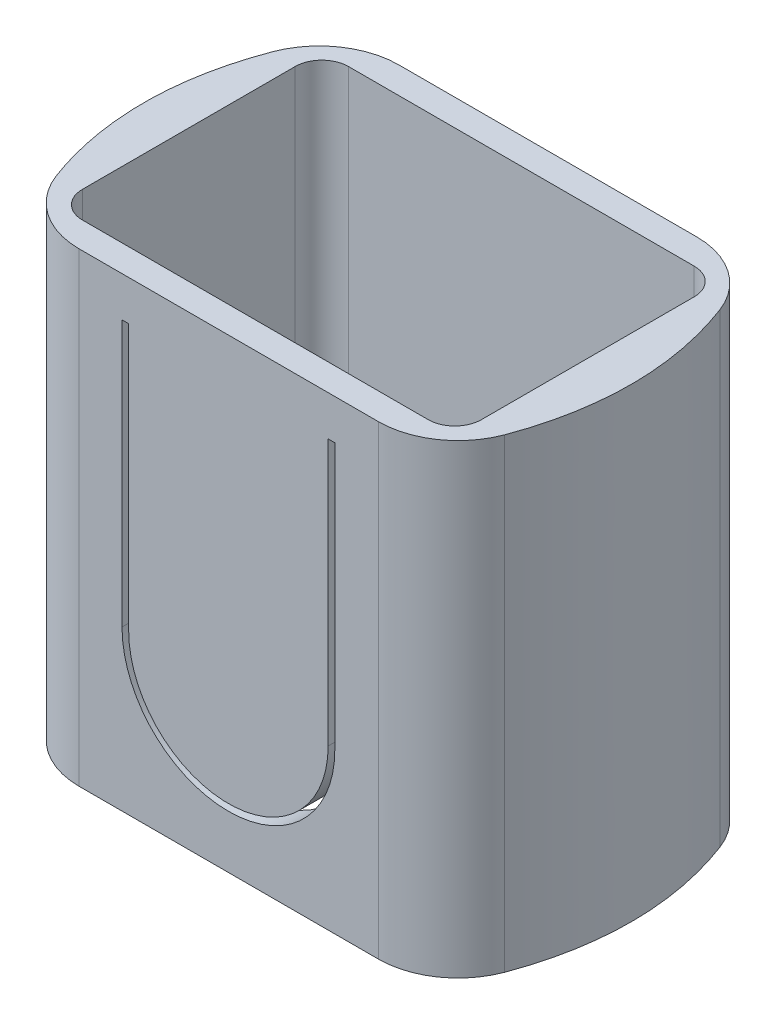
ISO-10303-21;
HEADER;
FILE_DESCRIPTION(('STEP AP214'),'2;1');
FILE_NAME('part.step','',(''),(''),'','','');
FILE_SCHEMA(('AUTOMOTIVE_DESIGN { 1 0 10303 214 1 1 1 1 }'));
ENDSEC;
DATA;
#1=APPLICATION_CONTEXT('core data for automotive mechanical design processes');
#2=APPLICATION_PROTOCOL_DEFINITION('international standard','automotive_design',2000,#1);
#3=PRODUCT_CONTEXT('',#1,'mechanical');
#4=PRODUCT('Part','Part','',(#3));
#5=PRODUCT_RELATED_PRODUCT_CATEGORY('part','',(#4));
#6=PRODUCT_DEFINITION_FORMATION('','',#4);
#7=PRODUCT_DEFINITION_CONTEXT('part definition',#1,'design');
#8=PRODUCT_DEFINITION('design','',#6,#7);
#9=PRODUCT_DEFINITION_SHAPE('','',#8);
#10=(LENGTH_UNIT() NAMED_UNIT(*) SI_UNIT(.MILLI.,.METRE.));
#11=(NAMED_UNIT(*) PLANE_ANGLE_UNIT() SI_UNIT($,.RADIAN.));
#12=(NAMED_UNIT(*) SI_UNIT($,.STERADIAN.) SOLID_ANGLE_UNIT());
#13=UNCERTAINTY_MEASURE_WITH_UNIT(LENGTH_MEASURE(1.E-05),#10,'distance_accuracy_value','');
#14=(GEOMETRIC_REPRESENTATION_CONTEXT(3) GLOBAL_UNCERTAINTY_ASSIGNED_CONTEXT((#13)) GLOBAL_UNIT_ASSIGNED_CONTEXT((#10,
#11,#12)) REPRESENTATION_CONTEXT('',''));
#15=CARTESIAN_POINT('',(0.,0.,0.));
#16=DIRECTION('',(0.,0.,1.));
#17=DIRECTION('',(1.,0.,0.));
#18=AXIS2_PLACEMENT_3D('',#15,#16,#17);
#19=CARTESIAN_POINT('',(-15.0000000000007,138.,7.9999999999995));
#20=DIRECTION('',(1.,0.,0.));
#21=DIRECTION('',(0.,0.,-1.));
#22=AXIS2_PLACEMENT_3D('',#19,#20,#21);
#23=PLANE('',#22);
#24=DIRECTION('',(0.,-1.,0.));
#25=VECTOR('',#24,1.);
#26=CARTESIAN_POINT('',(-15.0000000000007,138.,7.9999999999995));
#27=LINE('',#26,#25);
#28=CARTESIAN_POINT('',(-15.0000000000007,138.,7.9999999999995));
#29=VERTEX_POINT('',#28);
#30=CARTESIAN_POINT('',(-15.0000000000007,103.,7.9999999999995));
#31=VERTEX_POINT('',#30);
#32=EDGE_CURVE('E246',#29,#31,#27,.T.);
#33=ORIENTED_EDGE('',*,*,#32,.T.);
#34=DIRECTION('',(0.,0.,-1.));
#35=VECTOR('',#34,1.);
#36=CARTESIAN_POINT('',(-15.0000000000007,103.,7.9999999999995));
#37=LINE('',#36,#35);
#38=CARTESIAN_POINT('',(-14.9999999999993,103.,-6.93791118344122));
#39=VERTEX_POINT('',#38);
#40=EDGE_CURVE('E234',#31,#39,#37,.T.);
#41=ORIENTED_EDGE('',*,*,#40,.T.);
#42=DIRECTION('',(0.,-1.,0.));
#43=VECTOR('',#42,1.);
#44=CARTESIAN_POINT('',(-14.9999999999993,115.,-6.93791118344122));
#45=LINE('',#44,#43);
#46=CARTESIAN_POINT('',(-14.9999999999993,115.,-6.93791118344122));
#47=VERTEX_POINT('',#46);
#48=EDGE_CURVE('E244',#47,#39,#45,.T.);
#49=ORIENTED_EDGE('',*,*,#48,.F.);
#50=DIRECTION('',(0.,0.,1.));
#51=VECTOR('',#50,1.);
#52=CARTESIAN_POINT('',(-15.0000000000007,115.,7.9999999999995));
#53=LINE('',#52,#51);
#54=CARTESIAN_POINT('',(-14.9999999999993,115.,-8.0000000000005));
#55=VERTEX_POINT('',#54);
#56=EDGE_CURVE('E402',#55,#47,#53,.T.);
#57=ORIENTED_EDGE('',*,*,#56,.F.);
#58=DIRECTION('',(0.,-1.,0.));
#59=VECTOR('',#58,1.);
#60=CARTESIAN_POINT('',(-15.0000000000007,138.,-8.0000000000005));
#61=LINE('',#60,#59);
#62=CARTESIAN_POINT('',(-15.0000000000007,138.,-8.0000000000005));
#63=VERTEX_POINT('',#62);
#64=EDGE_CURVE('E311',#63,#55,#61,.T.);
#65=ORIENTED_EDGE('',*,*,#64,.F.);
#66=DIRECTION('',(0.,0.,1.));
#67=VECTOR('',#66,1.);
#68=CARTESIAN_POINT('',(-15.0000000000007,138.,7.9999999999995));
#69=LINE('',#68,#67);
#70=EDGE_CURVE('E297',#63,#29,#69,.T.);
#71=ORIENTED_EDGE('',*,*,#70,.T.);
#72=EDGE_LOOP('',(#33,#41,#49,#57,#65,#71));
#73=FACE_BOUND('',#72,.T.);
#74=ADVANCED_FACE('F33',(#73),#23,.T.);
#75=CARTESIAN_POINT('',(14.9999999999993,138.,7.9999999999995));
#76=DIRECTION('',(-1.,0.,0.));
#77=DIRECTION('',(0.,0.,1.));
#78=AXIS2_PLACEMENT_3D('',#75,#76,#77);
#79=PLANE('',#78);
#80=DIRECTION('',(0.,-1.,0.));
#81=VECTOR('',#80,1.);
#82=CARTESIAN_POINT('',(14.9999999999993,115.,-6.93791118344122));
#83=LINE('',#82,#81);
#84=CARTESIAN_POINT('',(14.9999999999993,115.,-6.93791118344122));
#85=VERTEX_POINT('',#84);
#86=CARTESIAN_POINT('',(14.9999999999993,103.,-6.93791118344121));
#87=VERTEX_POINT('',#86);
#88=EDGE_CURVE('E284',#85,#87,#83,.T.);
#89=ORIENTED_EDGE('',*,*,#88,.T.);
#90=DIRECTION('',(0.,0.,1.));
#91=VECTOR('',#90,1.);
#92=CARTESIAN_POINT('',(14.9999999999993,103.,7.9999999999995));
#93=LINE('',#92,#91);
#94=CARTESIAN_POINT('',(14.9999999999993,103.,7.9999999999995));
#95=VERTEX_POINT('',#94);
#96=EDGE_CURVE('E512',#87,#95,#93,.T.);
#97=ORIENTED_EDGE('',*,*,#96,.T.);
#98=DIRECTION('',(0.,-1.,0.));
#99=VECTOR('',#98,1.);
#100=CARTESIAN_POINT('',(14.9999999999993,138.,7.9999999999995));
#101=LINE('',#100,#99);
#102=CARTESIAN_POINT('',(14.9999999999993,138.,7.9999999999995));
#103=VERTEX_POINT('',#102);
#104=EDGE_CURVE('E323',#103,#95,#101,.T.);
#105=ORIENTED_EDGE('',*,*,#104,.F.);
#106=DIRECTION('',(0.,0.,-1.));
#107=VECTOR('',#106,1.);
#108=CARTESIAN_POINT('',(14.9999999999993,138.,7.9999999999995));
#109=LINE('',#108,#107);
#110=CARTESIAN_POINT('',(14.9999999999993,138.,-8.0000000000005));
#111=VERTEX_POINT('',#110);
#112=EDGE_CURVE('E289',#103,#111,#109,.T.);
#113=ORIENTED_EDGE('',*,*,#112,.T.);
#114=DIRECTION('',(0.,-1.,0.));
#115=VECTOR('',#114,1.);
#116=CARTESIAN_POINT('',(14.9999999999993,138.,-8.0000000000005));
#117=LINE('',#116,#115);
#118=CARTESIAN_POINT('',(14.9999999999993,115.,-8.0000000000005));
#119=VERTEX_POINT('',#118);
#120=EDGE_CURVE('E320',#111,#119,#117,.T.);
#121=ORIENTED_EDGE('',*,*,#120,.T.);
#122=DIRECTION('',(0.,0.,-1.));
#123=VECTOR('',#122,1.);
#124=CARTESIAN_POINT('',(14.9999999999993,115.,-10.0000000000005));
#125=LINE('',#124,#123);
#126=EDGE_CURVE('E268',#85,#119,#125,.T.);
#127=ORIENTED_EDGE('',*,*,#126,.F.);
#128=EDGE_LOOP('',(#89,#97,#105,#113,#121,#127));
#129=FACE_BOUND('',#128,.T.);
#130=ADVANCED_FACE('F587',(#129),#79,.T.);
#131=CARTESIAN_POINT('',(-11.1948285959103,138.,-6.00000000000053));
#132=DIRECTION('',(0.,-1.,0.));
#133=DIRECTION('',(0.,0.,-1.));
#134=AXIS2_PLACEMENT_3D('',#131,#132,#133);
#135=CYLINDRICAL_SURFACE('',#134,6.);
#136=CARTESIAN_POINT('',(-11.1948285959103,103.,-6.00000000000053));
#137=DIRECTION('',(0.,-1.,0.));
#138=DIRECTION('',(0.,0.,-1.));
#139=AXIS2_PLACEMENT_3D('',#136,#137,#138);
#140=CIRCLE('',#139,6.);
#141=CARTESIAN_POINT('',(-16.8116848392168,103.,-8.10972176886679));
#142=VERTEX_POINT('',#141);
#143=CARTESIAN_POINT('',(-11.1948285959103,103.,-12.0000000000005));
#144=VERTEX_POINT('',#143);
#145=EDGE_CURVE('E48',#142,#144,#140,.T.);
#146=ORIENTED_EDGE('',*,*,#145,.F.);
#147=DIRECTION('',(0.,-1.,0.));
#148=VECTOR('',#147,1.);
#149=CARTESIAN_POINT('',(-16.8116848392168,138.,-8.10972176886679));
#150=LINE('',#149,#148);
#151=CARTESIAN_POINT('',(-16.8116848392168,138.,-8.10972176886679));
#152=VERTEX_POINT('',#151);
#153=EDGE_CURVE('E397',#152,#142,#150,.T.);
#154=ORIENTED_EDGE('',*,*,#153,.F.);
#155=CARTESIAN_POINT('',(-11.1948285959103,138.,-6.00000000000053));
#156=DIRECTION('',(0.,1.,0.));
#157=DIRECTION('',(0.,0.,1.));
#158=AXIS2_PLACEMENT_3D('',#155,#156,#157);
#159=CIRCLE('',#158,6.);
#160=CARTESIAN_POINT('',(-11.1948285959103,138.,-12.0000000000005));
#161=VERTEX_POINT('',#160);
#162=EDGE_CURVE('E326',#161,#152,#159,.T.);
#163=ORIENTED_EDGE('',*,*,#162,.F.);
#164=DIRECTION('',(0.,-1.,0.));
#165=VECTOR('',#164,1.);
#166=CARTESIAN_POINT('',(-11.1948285959103,138.,-12.0000000000005));
#167=LINE('',#166,#165);
#168=EDGE_CURVE('E376',#161,#144,#167,.T.);
#169=ORIENTED_EDGE('',*,*,#168,.T.);
#170=EDGE_LOOP('',(#146,#154,#163,#169));
#171=FACE_BOUND('',#170,.T.);
#172=ADVANCED_FACE('F35',(#171),#135,.T.);
#173=CARTESIAN_POINT('',(-16.8116848392168,138.,-8.10972176886679));
#174=CARTESIAN_POINT('',(-17.8195265763753,138.,-5.42647593182652));
#175=CARTESIAN_POINT('',(-18.8343011976446,138.,-0.0284332988702621));
#176=CARTESIAN_POINT('',(-17.850691542806,138.,5.47265027087233));
#177=CARTESIAN_POINT('',(-16.8596172107994,138.,8.11035361792516));
#178=B_SPLINE_CURVE_WITH_KNOTS('',3,(#173,#174,#175,#176,#177),.UNSPECIFIED.,.F.,.F.,(4,1,4),
(0.167422492031923,0.502828221661461,0.83790507370678),.UNSPECIFIED.);
#179=DIRECTION('',(0.,-1.,0.));
#180=VECTOR('',#179,1.);
#181=SURFACE_OF_LINEAR_EXTRUSION('',#178,#180);
#182=CARTESIAN_POINT('',(-16.8116848392168,103.,-8.10972176886679));
#183=CARTESIAN_POINT('',(-17.8195265763753,103.,-5.42647593182652));
#184=CARTESIAN_POINT('',(-18.8343011976446,103.,-0.0284332988702621));
#185=CARTESIAN_POINT('',(-17.850691542806,103.,5.47265027087233));
#186=CARTESIAN_POINT('',(-16.8596172107994,103.,8.11035361792516));
#187=B_SPLINE_CURVE_WITH_KNOTS('',3,(#182,#183,#184,#185,#186),.UNSPECIFIED.,.F.,.F.,(4,1,4),
(0.167422492031923,0.502828221661461,0.83790507370678),.UNSPECIFIED.);
#188=CARTESIAN_POINT('',(-16.8596172107994,103.,8.11035361792516));
#189=VERTEX_POINT('',#188);
#190=EDGE_CURVE('E536',#189,#142,#187,.F.);
#191=ORIENTED_EDGE('',*,*,#190,.F.);
#192=DIRECTION('',(0.,-1.,0.));
#193=VECTOR('',#192,1.);
#194=CARTESIAN_POINT('',(-16.8596172107994,138.,8.11035361792516));
#195=LINE('',#194,#193);
#196=CARTESIAN_POINT('',(-16.8596172107994,138.,8.11035361792516));
#197=VERTEX_POINT('',#196);
#198=EDGE_CURVE('E394',#197,#189,#195,.T.);
#199=ORIENTED_EDGE('',*,*,#198,.F.);
#200=EDGE_CURVE('E329',#152,#197,#178,.T.);
#201=ORIENTED_EDGE('',*,*,#200,.F.);
#202=ORIENTED_EDGE('',*,*,#153,.T.);
#203=EDGE_LOOP('',(#191,#199,#201,#202));
#204=FACE_BOUND('',#203,.T.);
#205=ADVANCED_FACE('F339',(#204),#181,.F.);
#206=CARTESIAN_POINT('',(-11.2429983339921,138.,5.99999999999947));
#207=DIRECTION('',(0.,-1.,0.));
#208=DIRECTION('',(0.,0.,-1.));
#209=AXIS2_PLACEMENT_3D('',#206,#207,#208);
#210=CYLINDRICAL_SURFACE('',#209,6.);
#211=CARTESIAN_POINT('',(-11.2429983339921,103.,5.99999999999947));
#212=DIRECTION('',(0.,-1.,0.));
#213=DIRECTION('',(0.,0.,-1.));
#214=AXIS2_PLACEMENT_3D('',#211,#212,#213);
#215=CIRCLE('',#214,6.);
#216=CARTESIAN_POINT('',(-11.2429983339921,103.,11.9999999999995));
#217=VERTEX_POINT('',#216);
#218=EDGE_CURVE('E534',#217,#189,#215,.T.);
#219=ORIENTED_EDGE('',*,*,#218,.F.);
#220=DIRECTION('',(0.,-1.,0.));
#221=VECTOR('',#220,1.);
#222=CARTESIAN_POINT('',(-11.2429983339921,138.,11.9999999999995));
#223=LINE('',#222,#221);
#224=CARTESIAN_POINT('',(-11.2429983339921,138.,11.9999999999995));
#225=VERTEX_POINT('',#224);
#226=EDGE_CURVE('E391',#225,#217,#223,.T.);
#227=ORIENTED_EDGE('',*,*,#226,.F.);
#228=CARTESIAN_POINT('',(-11.2429983339921,138.,5.99999999999947));
#229=DIRECTION('',(0.,1.,0.));
#230=DIRECTION('',(0.,0.,-1.));
#231=AXIS2_PLACEMENT_3D('',#228,#229,#230);
#232=CIRCLE('',#231,6.);
#233=EDGE_CURVE('E334',#197,#225,#232,.T.);
#234=ORIENTED_EDGE('',*,*,#233,.F.);
#235=ORIENTED_EDGE('',*,*,#198,.T.);
#236=EDGE_LOOP('',(#219,#227,#234,#235));
#237=FACE_BOUND('',#236,.T.);
#238=ADVANCED_FACE('F342',(#237),#210,.T.);
#239=CARTESIAN_POINT('',(-11.2429983339921,138.,11.9999999999995));
#240=DIRECTION('',(0.,0.,-1.));
#241=DIRECTION('',(-1.,0.,0.));
#242=AXIS2_PLACEMENT_3D('',#239,#240,#241);
#243=PLANE('',#242);
#244=DIRECTION('',(0.,-1.,0.));
#245=VECTOR('',#244,1.);
#246=CARTESIAN_POINT('',(7.47635773627962,134.986611491829,11.9999999999995));
#247=LINE('',#246,#245);
#248=CARTESIAN_POINT('',(7.47635773627962,134.986611491829,11.9999999999995));
#249=VERTEX_POINT('',#248);
#250=CARTESIAN_POINT('',(7.47635773627963,114.986611491829,11.9999999999995));
#251=VERTEX_POINT('',#250);
#252=EDGE_CURVE('E546',#249,#251,#247,.T.);
#253=ORIENTED_EDGE('',*,*,#252,.F.);
#254=DIRECTION('',(-1.,0.,0.));
#255=VECTOR('',#254,1.);
#256=CARTESIAN_POINT('',(7.47635773627962,134.986611491829,11.9999999999995));
#257=LINE('',#256,#255);
#258=CARTESIAN_POINT('',(7.97635773627962,134.986611491829,11.9999999999995));
#259=VERTEX_POINT('',#258);
#260=EDGE_CURVE('E544',#259,#249,#257,.T.);
#261=ORIENTED_EDGE('',*,*,#260,.F.);
#262=DIRECTION('',(0.,1.,0.));
#263=VECTOR('',#262,1.);
#264=CARTESIAN_POINT('',(7.97635773627962,134.986611491829,11.9999999999995));
#265=LINE('',#264,#263);
#266=CARTESIAN_POINT('',(7.97635773627963,114.986611491829,11.9999999999995));
#267=VERTEX_POINT('',#266);
#268=EDGE_CURVE('E434',#267,#259,#265,.T.);
#269=ORIENTED_EDGE('',*,*,#268,.F.);
#270=CARTESIAN_POINT('',(-0.0236422637203737,114.986611491829,11.9999999999995));
#271=DIRECTION('',(0.,0.,1.));
#272=DIRECTION('',(-1.,0.,0.));
#273=AXIS2_PLACEMENT_3D('',#270,#271,#272);
#274=CIRCLE('',#273,8.);
#275=CARTESIAN_POINT('',(-8.02364226372038,114.986611491829,11.9999999999995));
#276=VERTEX_POINT('',#275);
#277=EDGE_CURVE('E559',#276,#267,#274,.T.);
#278=ORIENTED_EDGE('',*,*,#277,.F.);
#279=DIRECTION('',(0.,-1.,0.));
#280=VECTOR('',#279,1.);
#281=CARTESIAN_POINT('',(-8.02364226372038,114.986611491829,11.9999999999995));
#282=LINE('',#281,#280);
#283=CARTESIAN_POINT('',(-8.02364226372037,134.986611491829,11.9999999999995));
#284=VERTEX_POINT('',#283);
#285=EDGE_CURVE('E454',#284,#276,#282,.T.);
#286=ORIENTED_EDGE('',*,*,#285,.F.);
#287=DIRECTION('',(-1.,0.,0.));
#288=VECTOR('',#287,1.);
#289=CARTESIAN_POINT('',(-8.02364226372037,134.986611491829,11.9999999999995));
#290=LINE('',#289,#288);
#291=CARTESIAN_POINT('',(-7.52364226372038,134.986611491829,11.9999999999995));
#292=VERTEX_POINT('',#291);
#293=EDGE_CURVE('E555',#292,#284,#290,.T.);
#294=ORIENTED_EDGE('',*,*,#293,.F.);
#295=DIRECTION('',(0.,1.,0.));
#296=VECTOR('',#295,1.);
#297=CARTESIAN_POINT('',(-7.52364226372038,134.986611491829,11.9999999999995));
#298=LINE('',#297,#296);
#299=CARTESIAN_POINT('',(-7.52364226372037,114.986611491829,11.9999999999995));
#300=VERTEX_POINT('',#299);
#301=EDGE_CURVE('E552',#300,#292,#298,.T.);
#302=ORIENTED_EDGE('',*,*,#301,.F.);
#303=CARTESIAN_POINT('',(-0.0236422637203736,114.986611491829,11.9999999999995));
#304=DIRECTION('',(0.,0.,-1.));
#305=DIRECTION('',(-1.,0.,0.));
#306=AXIS2_PLACEMENT_3D('',#303,#304,#305);
#307=CIRCLE('',#306,7.5);
#308=EDGE_CURVE('E549',#251,#300,#307,.T.);
#309=ORIENTED_EDGE('',*,*,#308,.F.);
#310=EDGE_LOOP('',(#253,#261,#269,#278,#286,#294,#302,#309));
#311=FACE_BOUND('',#310,.T.);
#312=DIRECTION('',(-1.,0.,0.));
#313=VECTOR('',#312,1.);
#314=CARTESIAN_POINT('',(-11.2429983339921,103.,11.9999999999995));
#315=LINE('',#314,#313);
#316=CARTESIAN_POINT('',(11.2429983339906,103.,11.9999999999995));
#317=VERTEX_POINT('',#316);
#318=EDGE_CURVE('E532',#317,#217,#315,.T.);
#319=ORIENTED_EDGE('',*,*,#318,.F.);
#320=DIRECTION('',(0.,-1.,0.));
#321=VECTOR('',#320,1.);
#322=CARTESIAN_POINT('',(11.2429983339906,138.,11.9999999999995));
#323=LINE('',#322,#321);
#324=CARTESIAN_POINT('',(11.2429983339906,138.,11.9999999999995));
#325=VERTEX_POINT('',#324);
#326=EDGE_CURVE('E388',#325,#317,#323,.T.);
#327=ORIENTED_EDGE('',*,*,#326,.F.);
#328=DIRECTION('',(1.,0.,0.));
#329=VECTOR('',#328,1.);
#330=CARTESIAN_POINT('',(-11.2429983339921,138.,11.9999999999995));
#331=LINE('',#330,#329);
#332=EDGE_CURVE('E641',#225,#325,#331,.T.);
#333=ORIENTED_EDGE('',*,*,#332,.F.);
#334=ORIENTED_EDGE('',*,*,#226,.T.);
#335=EDGE_LOOP('',(#319,#327,#333,#334));
#336=FACE_BOUND('',#335,.T.);
#337=ADVANCED_FACE('F346',(#311,#336),#243,.F.);
#338=CARTESIAN_POINT('',(11.2429983339906,138.,5.99999999999947));
#339=DIRECTION('',(0.,-1.,0.));
#340=DIRECTION('',(0.,0.,-1.));
#341=AXIS2_PLACEMENT_3D('',#338,#339,#340);
#342=CYLINDRICAL_SURFACE('',#341,6.);
#343=CARTESIAN_POINT('',(11.2429983339906,103.,5.99999999999947));
#344=DIRECTION('',(0.,-1.,0.));
#345=DIRECTION('',(0.,0.,-1.));
#346=AXIS2_PLACEMENT_3D('',#343,#344,#345);
#347=CIRCLE('',#346,6.);
#348=CARTESIAN_POINT('',(16.8596172107979,103.,8.11035361792516));
#349=VERTEX_POINT('',#348);
#350=EDGE_CURVE('E527',#349,#317,#347,.T.);
#351=ORIENTED_EDGE('',*,*,#350,.F.);
#352=DIRECTION('',(0.,-1.,0.));
#353=VECTOR('',#352,1.);
#354=CARTESIAN_POINT('',(16.8596172107979,138.,8.11035361792516));
#355=LINE('',#354,#353);
#356=CARTESIAN_POINT('',(16.8596172107979,138.,8.11035361792516));
#357=VERTEX_POINT('',#356);
#358=EDGE_CURVE('E385',#357,#349,#355,.T.);
#359=ORIENTED_EDGE('',*,*,#358,.F.);
#360=CARTESIAN_POINT('',(11.2429983339906,138.,5.99999999999947));
#361=DIRECTION('',(0.,1.,0.));
#362=DIRECTION('',(0.,0.,1.));
#363=AXIS2_PLACEMENT_3D('',#360,#361,#362);
#364=CIRCLE('',#363,6.);
#365=EDGE_CURVE('E369',#325,#357,#364,.T.);
#366=ORIENTED_EDGE('',*,*,#365,.F.);
#367=ORIENTED_EDGE('',*,*,#326,.T.);
#368=EDGE_LOOP('',(#351,#359,#366,#367));
#369=FACE_BOUND('',#368,.T.);
#370=ADVANCED_FACE('F350',(#369),#342,.T.);
#371=CARTESIAN_POINT('',(16.8596172107979,138.,8.11035361792516));
#372=CARTESIAN_POINT('',(17.8506915428045,138.,5.47265027087233));
#373=CARTESIAN_POINT('',(18.8343011976431,138.,-0.0284332988702623));
#374=CARTESIAN_POINT('',(17.8195265763738,138.,-5.42647593182652));
#375=CARTESIAN_POINT('',(16.8116848392153,138.,-8.10972176886679));
#376=B_SPLINE_CURVE_WITH_KNOTS('',3,(#371,#372,#373,#374,#375),.UNSPECIFIED.,.F.,.F.,(4,1,4),
(0.167422492031923,0.502499344077242,0.83790507370678),.UNSPECIFIED.);
#377=DIRECTION('',(0.,-1.,0.));
#378=VECTOR('',#377,1.);
#379=SURFACE_OF_LINEAR_EXTRUSION('',#376,#378);
#380=CARTESIAN_POINT('',(16.8596172107979,103.,8.11035361792516));
#381=CARTESIAN_POINT('',(17.8506915428045,103.,5.47265027087233));
#382=CARTESIAN_POINT('',(18.8343011976431,103.,-0.0284332988702623));
#383=CARTESIAN_POINT('',(17.8195265763738,103.,-5.42647593182652));
#384=CARTESIAN_POINT('',(16.8116848392153,103.,-8.10972176886679));
#385=B_SPLINE_CURVE_WITH_KNOTS('',3,(#380,#381,#382,#383,#384),.UNSPECIFIED.,.F.,.F.,(4,1,4),
(0.167422492031923,0.502499344077242,0.83790507370678),.UNSPECIFIED.);
#386=CARTESIAN_POINT('',(16.8116848392153,103.,-8.10972176886679));
#387=VERTEX_POINT('',#386);
#388=EDGE_CURVE('E523',#387,#349,#385,.F.);
#389=ORIENTED_EDGE('',*,*,#388,.F.);
#390=DIRECTION('',(0.,-1.,0.));
#391=VECTOR('',#390,1.);
#392=CARTESIAN_POINT('',(16.8116848392153,138.,-8.10972176886679));
#393=LINE('',#392,#391);
#394=CARTESIAN_POINT('',(16.8116848392153,138.,-8.10972176886679));
#395=VERTEX_POINT('',#394);
#396=EDGE_CURVE('E382',#395,#387,#393,.T.);
#397=ORIENTED_EDGE('',*,*,#396,.F.);
#398=EDGE_CURVE('E362',#357,#395,#376,.T.);
#399=ORIENTED_EDGE('',*,*,#398,.F.);
#400=ORIENTED_EDGE('',*,*,#358,.T.);
#401=EDGE_LOOP('',(#389,#397,#399,#400));
#402=FACE_BOUND('',#401,.T.);
#403=ADVANCED_FACE('F354',(#402),#379,.F.);
#404=CARTESIAN_POINT('',(11.1948285959088,138.,-6.00000000000053));
#405=DIRECTION('',(0.,-1.,0.));
#406=DIRECTION('',(0.,0.,-1.));
#407=AXIS2_PLACEMENT_3D('',#404,#405,#406);
#408=CYLINDRICAL_SURFACE('',#407,6.);
#409=CARTESIAN_POINT('',(11.1948285959088,103.,-6.00000000000053));
#410=DIRECTION('',(0.,-1.,0.));
#411=DIRECTION('',(0.,0.,-1.));
#412=AXIS2_PLACEMENT_3D('',#409,#410,#411);
#413=CIRCLE('',#412,6.);
#414=CARTESIAN_POINT('',(11.1948285959088,103.,-12.0000000000005));
#415=VERTEX_POINT('',#414);
#416=EDGE_CURVE('E521',#415,#387,#413,.T.);
#417=ORIENTED_EDGE('',*,*,#416,.F.);
#418=DIRECTION('',(0.,-1.,0.));
#419=VECTOR('',#418,1.);
#420=CARTESIAN_POINT('',(11.1948285959088,138.,-12.0000000000005));
#421=LINE('',#420,#419);
#422=CARTESIAN_POINT('',(11.1948285959088,138.,-12.0000000000005));
#423=VERTEX_POINT('',#422);
#424=EDGE_CURVE('E379',#423,#415,#421,.T.);
#425=ORIENTED_EDGE('',*,*,#424,.F.);
#426=CARTESIAN_POINT('',(11.1948285959088,138.,-6.00000000000053));
#427=DIRECTION('',(0.,1.,0.));
#428=DIRECTION('',(0.,0.,-1.));
#429=AXIS2_PLACEMENT_3D('',#426,#427,#428);
#430=CIRCLE('',#429,6.);
#431=EDGE_CURVE('E368',#395,#423,#430,.T.);
#432=ORIENTED_EDGE('',*,*,#431,.F.);
#433=ORIENTED_EDGE('',*,*,#396,.T.);
#434=EDGE_LOOP('',(#417,#425,#432,#433));
#435=FACE_BOUND('',#434,.T.);
#436=ADVANCED_FACE('F359',(#435),#408,.T.);
#437=CARTESIAN_POINT('',(-11.1948285959103,138.,-12.0000000000005));
#438=DIRECTION('',(0.,0.,1.));
#439=DIRECTION('',(1.,0.,0.));
#440=AXIS2_PLACEMENT_3D('',#437,#438,#439);
#441=PLANE('',#440);
#442=DIRECTION('',(1.,0.,0.));
#443=VECTOR('',#442,1.);
#444=CARTESIAN_POINT('',(-11.1948285959103,103.,-12.0000000000005));
#445=LINE('',#444,#443);
#446=EDGE_CURVE('E519',#144,#415,#445,.T.);
#447=ORIENTED_EDGE('',*,*,#446,.F.);
#448=ORIENTED_EDGE('',*,*,#168,.F.);
#449=DIRECTION('',(-1.,0.,0.));
#450=VECTOR('',#449,1.);
#451=CARTESIAN_POINT('',(-11.1948285959103,138.,-12.0000000000005));
#452=LINE('',#451,#450);
#453=EDGE_CURVE('E374',#423,#161,#452,.T.);
#454=ORIENTED_EDGE('',*,*,#453,.F.);
#455=ORIENTED_EDGE('',*,*,#424,.T.);
#456=EDGE_LOOP('',(#447,#448,#454,#455));
#457=FACE_BOUND('',#456,.T.);
#458=ADVANCED_FACE('F611',(#457),#441,.F.);
#459=CARTESIAN_POINT('',(12.9999999999993,138.,7.9999999999995));
#460=DIRECTION('',(0.,-1.,0.));
#461=DIRECTION('',(0.,0.,-1.));
#462=AXIS2_PLACEMENT_3D('',#459,#460,#461);
#463=CYLINDRICAL_SURFACE('',#462,2.);
#464=ORIENTED_EDGE('',*,*,#104,.T.);
#465=CARTESIAN_POINT('',(12.9999999999993,103.,7.9999999999995));
#466=DIRECTION('',(0.,-1.,0.));
#467=DIRECTION('',(0.,0.,-1.));
#468=AXIS2_PLACEMENT_3D('',#465,#466,#467);
#469=CIRCLE('',#468,2.);
#470=CARTESIAN_POINT('',(12.9999999999993,103.,9.9999999999995));
#471=VERTEX_POINT('',#470);
#472=EDGE_CURVE('E509',#95,#471,#469,.T.);
#473=ORIENTED_EDGE('',*,*,#472,.T.);
#474=DIRECTION('',(0.,-1.,0.));
#475=VECTOR('',#474,1.);
#476=CARTESIAN_POINT('',(12.9999999999993,138.,9.9999999999995));
#477=LINE('',#476,#475);
#478=CARTESIAN_POINT('',(12.9999999999993,138.,9.9999999999995));
#479=VERTEX_POINT('',#478);
#480=EDGE_CURVE('E304',#479,#471,#477,.T.);
#481=ORIENTED_EDGE('',*,*,#480,.F.);
#482=CARTESIAN_POINT('',(12.9999999999993,138.,7.9999999999995));
#483=DIRECTION('',(0.,1.,0.));
#484=DIRECTION('',(0.,0.,-1.));
#485=AXIS2_PLACEMENT_3D('',#482,#483,#484);
#486=CIRCLE('',#485,2.);
#487=EDGE_CURVE('E287',#479,#103,#486,.T.);
#488=ORIENTED_EDGE('',*,*,#487,.T.);
#489=EDGE_LOOP('',(#464,#473,#481,#488));
#490=FACE_BOUND('',#489,.T.);
#491=ADVANCED_FACE('F603',(#490),#463,.F.);
#492=CARTESIAN_POINT('',(-13.0000000000007,138.,-10.0000000000005));
#493=DIRECTION('',(0.,0.,1.));
#494=DIRECTION('',(1.,0.,0.));
#495=AXIS2_PLACEMENT_3D('',#492,#493,#494);
#496=PLANE('',#495);
#497=DIRECTION('',(0.,-1.,0.));
#498=VECTOR('',#497,1.);
#499=CARTESIAN_POINT('',(-13.0000000000015,115.,-10.0000000000005));
#500=LINE('',#499,#498);
#501=CARTESIAN_POINT('',(-13.0000000000015,115.,-10.0000000000005));
#502=VERTEX_POINT('',#501);
#503=CARTESIAN_POINT('',(-13.0000000000015,103.,-10.0000000000005));
#504=VERTEX_POINT('',#503);
#505=EDGE_CURVE('E252',#502,#504,#500,.T.);
#506=ORIENTED_EDGE('',*,*,#505,.T.);
#507=DIRECTION('',(1.,0.,0.));
#508=VECTOR('',#507,1.);
#509=CARTESIAN_POINT('',(-13.0000000000007,103.,-10.0000000000005));
#510=LINE('',#509,#508);
#511=CARTESIAN_POINT('',(12.9999999999993,103.,-10.0000000000005));
#512=VERTEX_POINT('',#511);
#513=EDGE_CURVE('E499',#504,#512,#510,.T.);
#514=ORIENTED_EDGE('',*,*,#513,.T.);
#515=DIRECTION('',(0.,-1.,0.));
#516=VECTOR('',#515,1.);
#517=CARTESIAN_POINT('',(13.0000000000015,115.,-10.0000000000005));
#518=LINE('',#517,#516);
#519=CARTESIAN_POINT('',(12.9999999999993,115.,-10.0000000000005));
#520=VERTEX_POINT('',#519);
#521=EDGE_CURVE('E281',#520,#512,#518,.T.);
#522=ORIENTED_EDGE('',*,*,#521,.F.);
#523=DIRECTION('',(0.,-1.,0.));
#524=VECTOR('',#523,1.);
#525=CARTESIAN_POINT('',(12.9999999999993,138.,-10.0000000000005));
#526=LINE('',#525,#524);
#527=CARTESIAN_POINT('',(12.9999999999993,138.,-10.0000000000005));
#528=VERTEX_POINT('',#527);
#529=EDGE_CURVE('E317',#528,#520,#526,.T.);
#530=ORIENTED_EDGE('',*,*,#529,.F.);
#531=DIRECTION('',(-1.,0.,0.));
#532=VECTOR('',#531,1.);
#533=CARTESIAN_POINT('',(-13.0000000000007,138.,-10.0000000000005));
#534=LINE('',#533,#532);
#535=CARTESIAN_POINT('',(-13.0000000000007,138.,-10.0000000000005));
#536=VERTEX_POINT('',#535);
#537=EDGE_CURVE('E293',#528,#536,#534,.T.);
#538=ORIENTED_EDGE('',*,*,#537,.T.);
#539=DIRECTION('',(0.,-1.,0.));
#540=VECTOR('',#539,1.);
#541=CARTESIAN_POINT('',(-13.0000000000007,138.,-10.0000000000005));
#542=LINE('',#541,#540);
#543=EDGE_CURVE('E314',#536,#502,#542,.T.);
#544=ORIENTED_EDGE('',*,*,#543,.T.);
#545=EDGE_LOOP('',(#506,#514,#522,#530,#538,#544));
#546=FACE_BOUND('',#545,.T.);
#547=ADVANCED_FACE('F600',(#546),#496,.T.);
#548=CARTESIAN_POINT('',(-13.0000000000007,138.,7.9999999999995));
#549=DIRECTION('',(0.,-1.,0.));
#550=DIRECTION('',(0.,0.,-1.));
#551=AXIS2_PLACEMENT_3D('',#548,#549,#550);
#552=CYLINDRICAL_SURFACE('',#551,2.);
#553=DIRECTION('',(0.,-1.,0.));
#554=VECTOR('',#553,1.);
#555=CARTESIAN_POINT('',(-13.0000000000007,138.,9.99999999999951));
#556=LINE('',#555,#554);
#557=CARTESIAN_POINT('',(-13.0000000000007,138.,9.9999999999995));
#558=VERTEX_POINT('',#557);
#559=CARTESIAN_POINT('',(-13.0000000000007,103.,9.99999999999951));
#560=VERTEX_POINT('',#559);
#561=EDGE_CURVE('E307',#558,#560,#556,.T.);
#562=ORIENTED_EDGE('',*,*,#561,.T.);
#563=CARTESIAN_POINT('',(-13.0000000000007,103.,7.9999999999995));
#564=DIRECTION('',(0.,-1.,0.));
#565=DIRECTION('',(0.,0.,-1.));
#566=AXIS2_PLACEMENT_3D('',#563,#564,#565);
#567=CIRCLE('',#566,2.);
#568=EDGE_CURVE('E497',#560,#31,#567,.T.);
#569=ORIENTED_EDGE('',*,*,#568,.T.);
#570=ORIENTED_EDGE('',*,*,#32,.F.);
#571=CARTESIAN_POINT('',(-13.0000000000007,138.,7.9999999999995));
#572=DIRECTION('',(0.,1.,0.));
#573=DIRECTION('',(0.,0.,1.));
#574=AXIS2_PLACEMENT_3D('',#571,#572,#573);
#575=CIRCLE('',#574,2.);
#576=EDGE_CURVE('E299',#29,#558,#575,.T.);
#577=ORIENTED_EDGE('',*,*,#576,.T.);
#578=EDGE_LOOP('',(#562,#569,#570,#577));
#579=FACE_BOUND('',#578,.T.);
#580=ADVANCED_FACE('F496',(#579),#552,.F.);
#581=CARTESIAN_POINT('',(-13.0000000000007,138.,9.9999999999995));
#582=DIRECTION('',(0.,0.,-1.));
#583=DIRECTION('',(-1.,0.,0.));
#584=AXIS2_PLACEMENT_3D('',#581,#582,#583);
#585=PLANE('',#584);
#586=DIRECTION('',(1.,0.,0.));
#587=VECTOR('',#586,1.);
#588=CARTESIAN_POINT('',(-13.0000000000006,134.986611491828,9.9999999999995));
#589=LINE('',#588,#587);
#590=CARTESIAN_POINT('',(7.47635773627962,134.986611491829,9.9999999999995));
#591=VERTEX_POINT('',#590);
#592=CARTESIAN_POINT('',(7.97635773627962,134.986611491829,9.9999999999995));
#593=VERTEX_POINT('',#592);
#594=EDGE_CURVE('E41',#591,#593,#589,.T.);
#595=ORIENTED_EDGE('',*,*,#594,.F.);
#596=DIRECTION('',(0.,1.,0.));
#597=VECTOR('',#596,1.);
#598=CARTESIAN_POINT('',(7.47635773627962,138.,9.9999999999995));
#599=LINE('',#598,#597);
#600=CARTESIAN_POINT('',(7.47635773627963,114.986611491829,9.9999999999995));
#601=VERTEX_POINT('',#600);
#602=EDGE_CURVE('E404',#601,#591,#599,.T.);
#603=ORIENTED_EDGE('',*,*,#602,.F.);
#604=CARTESIAN_POINT('',(-0.0236422637203736,114.986611491829,9.9999999999995));
#605=DIRECTION('',(0.,0.,-1.));
#606=DIRECTION('',(-1.,0.,0.));
#607=AXIS2_PLACEMENT_3D('',#604,#605,#606);
#608=CIRCLE('',#607,7.5);
#609=CARTESIAN_POINT('',(-7.52364226372037,114.986611491829,9.9999999999995));
#610=VERTEX_POINT('',#609);
#611=EDGE_CURVE('E406',#610,#601,#608,.F.);
#612=ORIENTED_EDGE('',*,*,#611,.F.);
#613=DIRECTION('',(0.,-1.,0.));
#614=VECTOR('',#613,1.);
#615=CARTESIAN_POINT('',(-7.52364226372038,138.,9.9999999999995));
#616=LINE('',#615,#614);
#617=CARTESIAN_POINT('',(-7.52364226372038,134.986611491829,9.9999999999995));
#618=VERTEX_POINT('',#617);
#619=EDGE_CURVE('E409',#618,#610,#616,.T.);
#620=ORIENTED_EDGE('',*,*,#619,.F.);
#621=DIRECTION('',(1.,0.,0.));
#622=VECTOR('',#621,1.);
#623=CARTESIAN_POINT('',(-13.0000000000007,134.986611491829,9.9999999999995));
#624=LINE('',#623,#622);
#625=CARTESIAN_POINT('',(-8.02364226372037,134.986611491829,9.9999999999995));
#626=VERTEX_POINT('',#625);
#627=EDGE_CURVE('E411',#626,#618,#624,.T.);
#628=ORIENTED_EDGE('',*,*,#627,.F.);
#629=DIRECTION('',(0.,1.,0.));
#630=VECTOR('',#629,1.);
#631=CARTESIAN_POINT('',(-8.02364226372037,138.,9.9999999999995));
#632=LINE('',#631,#630);
#633=CARTESIAN_POINT('',(-8.02364226372038,114.986611491829,9.9999999999995));
#634=VERTEX_POINT('',#633);
#635=EDGE_CURVE('E413',#634,#626,#632,.T.);
#636=ORIENTED_EDGE('',*,*,#635,.F.);
#637=CARTESIAN_POINT('',(-0.0236422637203737,114.986611491829,9.9999999999995));
#638=DIRECTION('',(0.,0.,-1.));
#639=DIRECTION('',(-1.,0.,0.));
#640=AXIS2_PLACEMENT_3D('',#637,#638,#639);
#641=CIRCLE('',#640,8.);
#642=CARTESIAN_POINT('',(7.97635773627963,114.986611491829,9.9999999999995));
#643=VERTEX_POINT('',#642);
#644=EDGE_CURVE('E415',#643,#634,#641,.T.);
#645=ORIENTED_EDGE('',*,*,#644,.F.);
#646=DIRECTION('',(0.,-1.,0.));
#647=VECTOR('',#646,1.);
#648=CARTESIAN_POINT('',(7.97635773627962,138.,9.9999999999995));
#649=LINE('',#648,#647);
#650=EDGE_CURVE('E417',#593,#643,#649,.T.);
#651=ORIENTED_EDGE('',*,*,#650,.F.);
#652=EDGE_LOOP('',(#595,#603,#612,#620,#628,#636,#645,#651));
#653=FACE_BOUND('',#652,.T.);
#654=ORIENTED_EDGE('',*,*,#480,.T.);
#655=DIRECTION('',(-1.,0.,0.));
#656=VECTOR('',#655,1.);
#657=CARTESIAN_POINT('',(-13.0000000000007,103.,9.9999999999995));
#658=LINE('',#657,#656);
#659=EDGE_CURVE('E507',#471,#560,#658,.T.);
#660=ORIENTED_EDGE('',*,*,#659,.T.);
#661=ORIENTED_EDGE('',*,*,#561,.F.);
#662=DIRECTION('',(1.,0.,0.));
#663=VECTOR('',#662,1.);
#664=CARTESIAN_POINT('',(-13.0000000000007,138.,9.9999999999995));
#665=LINE('',#664,#663);
#666=EDGE_CURVE('E302',#558,#479,#665,.T.);
#667=ORIENTED_EDGE('',*,*,#666,.T.);
#668=EDGE_LOOP('',(#654,#660,#661,#667));
#669=FACE_BOUND('',#668,.T.);
#670=ADVANCED_FACE('F440',(#653,#669),#585,.T.);
#671=CARTESIAN_POINT('',(14.9999999999993,115.,-6.93791118344122));
#672=DIRECTION('',(0.,0.,-1.));
#673=DIRECTION('',(-1.,0.,0.));
#674=AXIS2_PLACEMENT_3D('',#671,#672,#673);
#675=PLANE('',#674);
#676=DIRECTION('',(-1.,0.,0.));
#677=VECTOR('',#676,1.);
#678=CARTESIAN_POINT('',(14.9999999999993,103.,-6.93791118344122));
#679=LINE('',#678,#677);
#680=CARTESIAN_POINT('',(13.5000000000015,103.,-6.93791118344122));
#681=VERTEX_POINT('',#680);
#682=EDGE_CURVE('E517',#87,#681,#679,.T.);
#683=ORIENTED_EDGE('',*,*,#682,.F.);
#684=ORIENTED_EDGE('',*,*,#88,.F.);
#685=DIRECTION('',(1.,0.,0.));
#686=VECTOR('',#685,1.);
#687=CARTESIAN_POINT('',(14.9999999999993,115.,-6.93791118344122));
#688=LINE('',#687,#686);
#689=CARTESIAN_POINT('',(13.5000000000015,115.,-6.93791118344122));
#690=VERTEX_POINT('',#689);
#691=EDGE_CURVE('E265',#690,#85,#688,.T.);
#692=ORIENTED_EDGE('',*,*,#691,.F.);
#693=DIRECTION('',(0.,-1.,0.));
#694=VECTOR('',#693,1.);
#695=CARTESIAN_POINT('',(13.5000000000015,115.,-6.93791118344122));
#696=LINE('',#695,#694);
#697=EDGE_CURVE('E275',#690,#681,#696,.T.);
#698=ORIENTED_EDGE('',*,*,#697,.T.);
#699=EDGE_LOOP('',(#683,#684,#692,#698));
#700=FACE_BOUND('',#699,.T.);
#701=ADVANCED_FACE('F774',(#700),#675,.F.);
#702=CARTESIAN_POINT('',(13.0000000000015,115.,-7.43791118344122));
#703=DIRECTION('',(1.,0.,0.));
#704=DIRECTION('',(0.,0.,-1.));
#705=AXIS2_PLACEMENT_3D('',#702,#703,#704);
#706=PLANE('',#705);
#707=DIRECTION('',(0.,0.,-1.));
#708=VECTOR('',#707,1.);
#709=CARTESIAN_POINT('',(13.0000000000015,103.,-7.43791118344122));
#710=LINE('',#709,#708);
#711=CARTESIAN_POINT('',(13.0000000000015,103.,-7.43791118344122));
#712=VERTEX_POINT('',#711);
#713=EDGE_CURVE('E502',#712,#512,#710,.T.);
#714=ORIENTED_EDGE('',*,*,#713,.F.);
#715=DIRECTION('',(0.,-1.,0.));
#716=VECTOR('',#715,1.);
#717=CARTESIAN_POINT('',(13.0000000000015,115.,-7.43791118344122));
#718=LINE('',#717,#716);
#719=CARTESIAN_POINT('',(13.0000000000015,115.,-7.43791118344122));
#720=VERTEX_POINT('',#719);
#721=EDGE_CURVE('E278',#720,#712,#718,.T.);
#722=ORIENTED_EDGE('',*,*,#721,.F.);
#723=DIRECTION('',(0.,0.,1.));
#724=VECTOR('',#723,1.);
#725=CARTESIAN_POINT('',(13.0000000000015,115.,-7.43791118344122));
#726=LINE('',#725,#724);
#727=EDGE_CURVE('E271',#520,#720,#726,.T.);
#728=ORIENTED_EDGE('',*,*,#727,.F.);
#729=ORIENTED_EDGE('',*,*,#521,.T.);
#730=EDGE_LOOP('',(#714,#722,#728,#729));
#731=FACE_BOUND('',#730,.T.);
#732=ADVANCED_FACE('F782',(#731),#706,.F.);
#733=CARTESIAN_POINT('',(13.5000000000015,115.,-7.43791118344122));
#734=DIRECTION('',(0.,-1.,0.));
#735=DIRECTION('',(0.,0.,-1.));
#736=AXIS2_PLACEMENT_3D('',#733,#734,#735);
#737=CYLINDRICAL_SURFACE('',#736,0.5);
#738=CARTESIAN_POINT('',(13.5000000000015,103.,-7.43791118344122));
#739=DIRECTION('',(0.,-1.,0.));
#740=DIRECTION('',(0.,0.,-1.));
#741=AXIS2_PLACEMENT_3D('',#738,#739,#740);
#742=CIRCLE('',#741,0.5);
#743=EDGE_CURVE('E515',#681,#712,#742,.T.);
#744=ORIENTED_EDGE('',*,*,#743,.F.);
#745=ORIENTED_EDGE('',*,*,#697,.F.);
#746=CARTESIAN_POINT('',(13.5000000000015,115.,-7.43791118344122));
#747=DIRECTION('',(0.,1.,0.));
#748=DIRECTION('',(0.,0.,-1.));
#749=AXIS2_PLACEMENT_3D('',#746,#747,#748);
#750=CIRCLE('',#749,0.5);
#751=EDGE_CURVE('E273',#720,#690,#750,.T.);
#752=ORIENTED_EDGE('',*,*,#751,.F.);
#753=ORIENTED_EDGE('',*,*,#721,.T.);
#754=EDGE_LOOP('',(#744,#745,#752,#753));
#755=FACE_BOUND('',#754,.T.);
#756=ADVANCED_FACE('F792',(#755),#737,.T.);
#757=CARTESIAN_POINT('',(-13.5000000000015,115.,-7.43791118344122));
#758=DIRECTION('',(0.,-1.,0.));
#759=DIRECTION('',(0.,0.,-1.));
#760=AXIS2_PLACEMENT_3D('',#757,#758,#759);
#761=CYLINDRICAL_SURFACE('',#760,0.5);
#762=CARTESIAN_POINT('',(-13.5000000000015,103.,-7.43791118344122));
#763=DIRECTION('',(0.,-1.,0.));
#764=DIRECTION('',(0.,0.,-1.));
#765=AXIS2_PLACEMENT_3D('',#762,#763,#764);
#766=CIRCLE('',#765,0.5);
#767=CARTESIAN_POINT('',(-13.0000000000015,103.,-7.43791118344122));
#768=VERTEX_POINT('',#767);
#769=CARTESIAN_POINT('',(-13.5000000000015,103.,-6.93791118344122));
#770=VERTEX_POINT('',#769);
#771=EDGE_CURVE('E55',#768,#770,#766,.T.);
#772=ORIENTED_EDGE('',*,*,#771,.F.);
#773=DIRECTION('',(0.,-1.,0.));
#774=VECTOR('',#773,1.);
#775=CARTESIAN_POINT('',(-13.0000000000015,115.,-7.43791118344122));
#776=LINE('',#775,#774);
#777=CARTESIAN_POINT('',(-13.0000000000015,115.,-7.43791118344122));
#778=VERTEX_POINT('',#777);
#779=EDGE_CURVE('E256',#778,#768,#776,.T.);
#780=ORIENTED_EDGE('',*,*,#779,.F.);
#781=CARTESIAN_POINT('',(-13.5000000000015,115.,-7.43791118344122));
#782=DIRECTION('',(0.,1.,0.));
#783=DIRECTION('',(0.,0.,1.));
#784=AXIS2_PLACEMENT_3D('',#781,#782,#783);
#785=CIRCLE('',#784,0.5);
#786=CARTESIAN_POINT('',(-13.5000000000015,115.,-6.93791118344122));
#787=VERTEX_POINT('',#786);
#788=EDGE_CURVE('E436',#787,#778,#785,.T.);
#789=ORIENTED_EDGE('',*,*,#788,.F.);
#790=DIRECTION('',(0.,-1.,0.));
#791=VECTOR('',#790,1.);
#792=CARTESIAN_POINT('',(-13.5000000000015,115.,-6.93791118344122));
#793=LINE('',#792,#791);
#794=EDGE_CURVE('E253',#787,#770,#793,.T.);
#795=ORIENTED_EDGE('',*,*,#794,.T.);
#796=EDGE_LOOP('',(#772,#780,#789,#795));
#797=FACE_BOUND('',#796,.T.);
#798=ADVANCED_FACE('F476',(#797),#761,.T.);
#799=CARTESIAN_POINT('',(-13.0000000000015,115.,-7.43791118344122));
#800=DIRECTION('',(-1.,0.,0.));
#801=DIRECTION('',(0.,0.,1.));
#802=AXIS2_PLACEMENT_3D('',#799,#800,#801);
#803=PLANE('',#802);
#804=DIRECTION('',(0.,0.,1.));
#805=VECTOR('',#804,1.);
#806=CARTESIAN_POINT('',(-13.0000000000015,103.,-7.43791118344122));
#807=LINE('',#806,#805);
#808=EDGE_CURVE('E247',#504,#768,#807,.T.);
#809=ORIENTED_EDGE('',*,*,#808,.F.);
#810=ORIENTED_EDGE('',*,*,#505,.F.);
#811=DIRECTION('',(0.,0.,-1.));
#812=VECTOR('',#811,1.);
#813=CARTESIAN_POINT('',(-13.0000000000015,115.,-7.43791118344122));
#814=LINE('',#813,#812);
#815=EDGE_CURVE('E470',#778,#502,#814,.T.);
#816=ORIENTED_EDGE('',*,*,#815,.F.);
#817=ORIENTED_EDGE('',*,*,#779,.T.);
#818=EDGE_LOOP('',(#809,#810,#816,#817));
#819=FACE_BOUND('',#818,.T.);
#820=ADVANCED_FACE('F479',(#819),#803,.F.);
#821=CARTESIAN_POINT('',(-14.9999999999993,115.,-6.93791118344122));
#822=DIRECTION('',(0.,0.,-1.));
#823=DIRECTION('',(-1.,0.,0.));
#824=AXIS2_PLACEMENT_3D('',#821,#822,#823);
#825=PLANE('',#824);
#826=DIRECTION('',(-1.,0.,0.));
#827=VECTOR('',#826,1.);
#828=CARTESIAN_POINT('',(-14.9999999999993,103.,-6.93791118344122));
#829=LINE('',#828,#827);
#830=EDGE_CURVE('E11',#770,#39,#829,.T.);
#831=ORIENTED_EDGE('',*,*,#830,.F.);
#832=ORIENTED_EDGE('',*,*,#794,.F.);
#833=DIRECTION('',(1.,0.,0.));
#834=VECTOR('',#833,1.);
#835=CARTESIAN_POINT('',(-14.9999999999993,115.,-6.93791118344122));
#836=LINE('',#835,#834);
#837=EDGE_CURVE('E251',#47,#787,#836,.T.);
#838=ORIENTED_EDGE('',*,*,#837,.F.);
#839=ORIENTED_EDGE('',*,*,#48,.T.);
#840=EDGE_LOOP('',(#831,#832,#838,#839));
#841=FACE_BOUND('',#840,.T.);
#842=ADVANCED_FACE('F250',(#841),#825,.F.);
#843=CARTESIAN_POINT('',(12.9999999999993,138.,-8.0000000000005));
#844=DIRECTION('',(0.,-1.,0.));
#845=DIRECTION('',(0.,0.,-1.));
#846=AXIS2_PLACEMENT_3D('',#843,#844,#845);
#847=CYLINDRICAL_SURFACE('',#846,2.);
#848=ORIENTED_EDGE('',*,*,#529,.T.);
#849=CARTESIAN_POINT('',(12.9999999999993,115.,-8.0000000000005));
#850=DIRECTION('',(0.,-1.,0.));
#851=DIRECTION('',(0.,0.,-1.));
#852=AXIS2_PLACEMENT_3D('',#849,#850,#851);
#853=CIRCLE('',#852,2.);
#854=EDGE_CURVE('E400',#520,#119,#853,.T.);
#855=ORIENTED_EDGE('',*,*,#854,.T.);
#856=ORIENTED_EDGE('',*,*,#120,.F.);
#857=CARTESIAN_POINT('',(12.9999999999993,138.,-8.0000000000005));
#858=DIRECTION('',(0.,1.,0.));
#859=DIRECTION('',(0.,0.,-1.));
#860=AXIS2_PLACEMENT_3D('',#857,#858,#859);
#861=CIRCLE('',#860,2.);
#862=EDGE_CURVE('E291',#111,#528,#861,.T.);
#863=ORIENTED_EDGE('',*,*,#862,.T.);
#864=EDGE_LOOP('',(#848,#855,#856,#863));
#865=FACE_BOUND('',#864,.T.);
#866=ADVANCED_FACE('F605',(#865),#847,.F.);
#867=CARTESIAN_POINT('',(-11.1948285959103,138.,-6.00000000000053));
#868=DIRECTION('',(0.,1.,0.));
#869=DIRECTION('',(0.,0.,1.));
#870=AXIS2_PLACEMENT_3D('',#867,#868,#869);
#871=PLANE('',#870);
#872=ORIENTED_EDGE('',*,*,#162,.T.);
#873=ORIENTED_EDGE('',*,*,#200,.T.);
#874=ORIENTED_EDGE('',*,*,#233,.T.);
#875=ORIENTED_EDGE('',*,*,#332,.T.);
#876=ORIENTED_EDGE('',*,*,#365,.T.);
#877=ORIENTED_EDGE('',*,*,#398,.T.);
#878=ORIENTED_EDGE('',*,*,#431,.T.);
#879=ORIENTED_EDGE('',*,*,#453,.T.);
#880=EDGE_LOOP('',(#872,#873,#874,#875,#876,#877,#878,#879));
#881=FACE_BOUND('',#880,.T.);
#882=ORIENTED_EDGE('',*,*,#112,.F.);
#883=ORIENTED_EDGE('',*,*,#487,.F.);
#884=ORIENTED_EDGE('',*,*,#666,.F.);
#885=ORIENTED_EDGE('',*,*,#576,.F.);
#886=ORIENTED_EDGE('',*,*,#70,.F.);
#887=CARTESIAN_POINT('',(-13.0000000000007,138.,-8.0000000000005));
#888=DIRECTION('',(0.,1.,0.));
#889=DIRECTION('',(0.,0.,1.));
#890=AXIS2_PLACEMENT_3D('',#887,#888,#889);
#891=CIRCLE('',#890,2.);
#892=EDGE_CURVE('E295',#536,#63,#891,.T.);
#893=ORIENTED_EDGE('',*,*,#892,.F.);
#894=ORIENTED_EDGE('',*,*,#537,.F.);
#895=ORIENTED_EDGE('',*,*,#862,.F.);
#896=EDGE_LOOP('',(#882,#883,#884,#885,#886,#893,#894,#895));
#897=FACE_BOUND('',#896,.T.);
#898=ADVANCED_FACE('F491',(#881,#897),#871,.T.);
#899=CARTESIAN_POINT('',(-13.0000000000007,138.,-8.0000000000005));
#900=DIRECTION('',(0.,-1.,0.));
#901=DIRECTION('',(0.,0.,-1.));
#902=AXIS2_PLACEMENT_3D('',#899,#900,#901);
#903=CYLINDRICAL_SURFACE('',#902,2.);
#904=CARTESIAN_POINT('',(-13.0000000000007,115.,-8.0000000000005));
#905=DIRECTION('',(0.,1.,0.));
#906=DIRECTION('',(0.,0.,1.));
#907=AXIS2_PLACEMENT_3D('',#904,#905,#906);
#908=CIRCLE('',#907,2.);
#909=EDGE_CURVE('E263',#502,#55,#908,.T.);
#910=ORIENTED_EDGE('',*,*,#909,.F.);
#911=ORIENTED_EDGE('',*,*,#543,.F.);
#912=ORIENTED_EDGE('',*,*,#892,.T.);
#913=ORIENTED_EDGE('',*,*,#64,.T.);
#914=EDGE_LOOP('',(#910,#911,#912,#913));
#915=FACE_BOUND('',#914,.T.);
#916=ADVANCED_FACE('F486',(#915),#903,.F.);
#917=CARTESIAN_POINT('',(13.5000000000015,115.,-7.43791118344122));
#918=DIRECTION('',(0.,-1.,0.));
#919=DIRECTION('',(0.,0.,-1.));
#920=AXIS2_PLACEMENT_3D('',#917,#918,#919);
#921=PLANE('',#920);
#922=ORIENTED_EDGE('',*,*,#854,.F.);
#923=ORIENTED_EDGE('',*,*,#727,.T.);
#924=ORIENTED_EDGE('',*,*,#751,.T.);
#925=ORIENTED_EDGE('',*,*,#691,.T.);
#926=ORIENTED_EDGE('',*,*,#126,.T.);
#927=EDGE_LOOP('',(#922,#923,#924,#925,#926));
#928=FACE_BOUND('',#927,.T.);
#929=ADVANCED_FACE('F599',(#928),#921,.F.);
#930=CARTESIAN_POINT('',(-13.5000000000015,115.,-7.43791118344122));
#931=DIRECTION('',(0.,1.,0.));
#932=DIRECTION('',(0.,0.,1.));
#933=AXIS2_PLACEMENT_3D('',#930,#931,#932);
#934=PLANE('',#933);
#935=ORIENTED_EDGE('',*,*,#815,.T.);
#936=ORIENTED_EDGE('',*,*,#909,.T.);
#937=ORIENTED_EDGE('',*,*,#56,.T.);
#938=ORIENTED_EDGE('',*,*,#837,.T.);
#939=ORIENTED_EDGE('',*,*,#788,.T.);
#940=EDGE_LOOP('',(#935,#936,#937,#938,#939));
#941=FACE_BOUND('',#940,.T.);
#942=ADVANCED_FACE('F472',(#941),#934,.T.);
#943=CARTESIAN_POINT('',(7.47635773627962,134.986611491829,8.99999999999947));
#944=DIRECTION('',(0.,1.,0.));
#945=DIRECTION('',(-1.,0.,0.));
#946=AXIS2_PLACEMENT_3D('',#943,#944,#945);
#947=PLANE('',#946);
#948=ORIENTED_EDGE('',*,*,#594,.T.);
#949=DIRECTION('',(0.,0.,1.));
#950=VECTOR('',#949,1.);
#951=CARTESIAN_POINT('',(7.97635773627962,134.986611491829,8.99999999999947));
#952=LINE('',#951,#950);
#953=EDGE_CURVE('E423',#593,#259,#952,.T.);
#954=ORIENTED_EDGE('',*,*,#953,.T.);
#955=ORIENTED_EDGE('',*,*,#260,.T.);
#956=DIRECTION('',(0.,0.,1.));
#957=VECTOR('',#956,1.);
#958=CARTESIAN_POINT('',(7.47635773627962,134.986611491829,8.99999999999947));
#959=LINE('',#958,#957);
#960=EDGE_CURVE('E426',#591,#249,#959,.T.);
#961=ORIENTED_EDGE('',*,*,#960,.F.);
#962=EDGE_LOOP('',(#948,#954,#955,#961));
#963=FACE_BOUND('',#962,.T.);
#964=ADVANCED_FACE('F422',(#963),#947,.F.);
#965=CARTESIAN_POINT('',(7.97635773627962,134.986611491829,8.99999999999947));
#966=DIRECTION('',(1.,0.,0.));
#967=DIRECTION('',(0.,0.,-1.));
#968=AXIS2_PLACEMENT_3D('',#965,#966,#967);
#969=PLANE('',#968);
#970=ORIENTED_EDGE('',*,*,#650,.T.);
#971=DIRECTION('',(0.,0.,1.));
#972=VECTOR('',#971,1.);
#973=CARTESIAN_POINT('',(7.97635773627963,114.986611491829,8.99999999999947));
#974=LINE('',#973,#972);
#975=EDGE_CURVE('E437',#643,#267,#974,.T.);
#976=ORIENTED_EDGE('',*,*,#975,.T.);
#977=ORIENTED_EDGE('',*,*,#268,.T.);
#978=ORIENTED_EDGE('',*,*,#953,.F.);
#979=EDGE_LOOP('',(#970,#976,#977,#978));
#980=FACE_BOUND('',#979,.T.);
#981=ADVANCED_FACE('F431',(#980),#969,.F.);
#982=CARTESIAN_POINT('',(-0.0236422637203737,114.986611491829,8.99999999999947));
#983=DIRECTION('',(0.,0.,1.));
#984=DIRECTION('',(1.,0.,0.));
#985=AXIS2_PLACEMENT_3D('',#982,#983,#984);
#986=CYLINDRICAL_SURFACE('',#985,8.);
#987=ORIENTED_EDGE('',*,*,#644,.T.);
#988=DIRECTION('',(0.,0.,1.));
#989=VECTOR('',#988,1.);
#990=CARTESIAN_POINT('',(-8.02364226372038,114.986611491829,8.99999999999947));
#991=LINE('',#990,#989);
#992=EDGE_CURVE('E448',#634,#276,#991,.T.);
#993=ORIENTED_EDGE('',*,*,#992,.T.);
#994=ORIENTED_EDGE('',*,*,#277,.T.);
#995=ORIENTED_EDGE('',*,*,#975,.F.);
#996=EDGE_LOOP('',(#987,#993,#994,#995));
#997=FACE_BOUND('',#996,.T.);
#998=ADVANCED_FACE('F446',(#997),#986,.F.);
#999=CARTESIAN_POINT('',(-8.02364226372038,114.986611491829,8.99999999999947));
#1000=DIRECTION('',(-1.,0.,0.));
#1001=DIRECTION('',(0.,-1.,0.));
#1002=AXIS2_PLACEMENT_3D('',#999,#1000,#1001);
#1003=PLANE('',#1002);
#1004=ORIENTED_EDGE('',*,*,#635,.T.);
#1005=DIRECTION('',(0.,0.,1.));
#1006=VECTOR('',#1005,1.);
#1007=CARTESIAN_POINT('',(-8.02364226372037,134.986611491829,8.99999999999947));
#1008=LINE('',#1007,#1006);
#1009=EDGE_CURVE('E456',#626,#284,#1008,.T.);
#1010=ORIENTED_EDGE('',*,*,#1009,.T.);
#1011=ORIENTED_EDGE('',*,*,#285,.T.);
#1012=ORIENTED_EDGE('',*,*,#992,.F.);
#1013=EDGE_LOOP('',(#1004,#1010,#1011,#1012));
#1014=FACE_BOUND('',#1013,.T.);
#1015=ADVANCED_FACE('F451',(#1014),#1003,.F.);
#1016=CARTESIAN_POINT('',(-8.02364226372037,134.986611491829,8.99999999999947));
#1017=DIRECTION('',(0.,1.,0.));
#1018=DIRECTION('',(0.,0.,1.));
#1019=AXIS2_PLACEMENT_3D('',#1016,#1017,#1018);
#1020=PLANE('',#1019);
#1021=ORIENTED_EDGE('',*,*,#627,.T.);
#1022=DIRECTION('',(0.,0.,1.));
#1023=VECTOR('',#1022,1.);
#1024=CARTESIAN_POINT('',(-7.52364226372038,134.986611491829,8.99999999999947));
#1025=LINE('',#1024,#1023);
#1026=EDGE_CURVE('E459',#618,#292,#1025,.T.);
#1027=ORIENTED_EDGE('',*,*,#1026,.T.);
#1028=ORIENTED_EDGE('',*,*,#293,.T.);
#1029=ORIENTED_EDGE('',*,*,#1009,.F.);
#1030=EDGE_LOOP('',(#1021,#1027,#1028,#1029));
#1031=FACE_BOUND('',#1030,.T.);
#1032=ADVANCED_FACE('F577',(#1031),#1020,.F.);
#1033=CARTESIAN_POINT('',(-7.52364226372038,134.986611491829,8.99999999999947));
#1034=DIRECTION('',(1.,0.,0.));
#1035=DIRECTION('',(0.,1.,0.));
#1036=AXIS2_PLACEMENT_3D('',#1033,#1034,#1035);
#1037=PLANE('',#1036);
#1038=ORIENTED_EDGE('',*,*,#619,.T.);
#1039=DIRECTION('',(0.,0.,1.));
#1040=VECTOR('',#1039,1.);
#1041=CARTESIAN_POINT('',(-7.52364226372037,114.986611491829,8.99999999999947));
#1042=LINE('',#1041,#1040);
#1043=EDGE_CURVE('E463',#610,#300,#1042,.T.);
#1044=ORIENTED_EDGE('',*,*,#1043,.T.);
#1045=ORIENTED_EDGE('',*,*,#301,.T.);
#1046=ORIENTED_EDGE('',*,*,#1026,.F.);
#1047=EDGE_LOOP('',(#1038,#1044,#1045,#1046));
#1048=FACE_BOUND('',#1047,.T.);
#1049=ADVANCED_FACE('F573',(#1048),#1037,.F.);
#1050=CARTESIAN_POINT('',(-0.0236422637203736,114.986611491829,8.99999999999947));
#1051=DIRECTION('',(0.,0.,1.));
#1052=DIRECTION('',(1.,0.,0.));
#1053=AXIS2_PLACEMENT_3D('',#1050,#1051,#1052);
#1054=CYLINDRICAL_SURFACE('',#1053,7.5);
#1055=ORIENTED_EDGE('',*,*,#611,.T.);
#1056=DIRECTION('',(0.,0.,1.));
#1057=VECTOR('',#1056,1.);
#1058=CARTESIAN_POINT('',(7.47635773627963,114.986611491829,8.99999999999947));
#1059=LINE('',#1058,#1057);
#1060=EDGE_CURVE('E465',#601,#251,#1059,.T.);
#1061=ORIENTED_EDGE('',*,*,#1060,.T.);
#1062=ORIENTED_EDGE('',*,*,#308,.T.);
#1063=ORIENTED_EDGE('',*,*,#1043,.F.);
#1064=EDGE_LOOP('',(#1055,#1061,#1062,#1063));
#1065=FACE_BOUND('',#1064,.T.);
#1066=ADVANCED_FACE('F570',(#1065),#1054,.T.);
#1067=CARTESIAN_POINT('',(7.47635773627962,134.986611491829,8.99999999999947));
#1068=DIRECTION('',(-1.,0.,0.));
#1069=DIRECTION('',(0.,-1.,0.));
#1070=AXIS2_PLACEMENT_3D('',#1067,#1068,#1069);
#1071=PLANE('',#1070);
#1072=ORIENTED_EDGE('',*,*,#602,.T.);
#1073=ORIENTED_EDGE('',*,*,#960,.T.);
#1074=ORIENTED_EDGE('',*,*,#252,.T.);
#1075=ORIENTED_EDGE('',*,*,#1060,.F.);
#1076=EDGE_LOOP('',(#1072,#1073,#1074,#1075));
#1077=FACE_BOUND('',#1076,.T.);
#1078=ADVANCED_FACE('F565',(#1077),#1071,.F.);
#1079=CARTESIAN_POINT('',(0.,103.,0.));
#1080=DIRECTION('',(0.,-1.,0.));
#1081=DIRECTION('',(0.,0.,-1.));
#1082=AXIS2_PLACEMENT_3D('',#1079,#1080,#1081);
#1083=PLANE('',#1082);
#1084=ORIENTED_EDGE('',*,*,#682,.T.);
#1085=ORIENTED_EDGE('',*,*,#743,.T.);
#1086=ORIENTED_EDGE('',*,*,#713,.T.);
#1087=ORIENTED_EDGE('',*,*,#513,.F.);
#1088=ORIENTED_EDGE('',*,*,#808,.T.);
#1089=ORIENTED_EDGE('',*,*,#771,.T.);
#1090=ORIENTED_EDGE('',*,*,#830,.T.);
#1091=ORIENTED_EDGE('',*,*,#40,.F.);
#1092=ORIENTED_EDGE('',*,*,#568,.F.);
#1093=ORIENTED_EDGE('',*,*,#659,.F.);
#1094=ORIENTED_EDGE('',*,*,#472,.F.);
#1095=ORIENTED_EDGE('',*,*,#96,.F.);
#1096=EDGE_LOOP('',(#1084,#1085,#1086,#1087,#1088,#1089,#1090,#1091,#1092,#1093,#1094,#1095));
#1097=FACE_BOUND('',#1096,.T.);
#1098=ORIENTED_EDGE('',*,*,#145,.T.);
#1099=ORIENTED_EDGE('',*,*,#446,.T.);
#1100=ORIENTED_EDGE('',*,*,#416,.T.);
#1101=ORIENTED_EDGE('',*,*,#388,.T.);
#1102=ORIENTED_EDGE('',*,*,#350,.T.);
#1103=ORIENTED_EDGE('',*,*,#318,.T.);
#1104=ORIENTED_EDGE('',*,*,#218,.T.);
#1105=ORIENTED_EDGE('',*,*,#190,.T.);
#1106=EDGE_LOOP('',(#1098,#1099,#1100,#1101,#1102,#1103,#1104,#1105));
#1107=FACE_BOUND('',#1106,.T.);
#1108=ADVANCED_FACE('F233',(#1097,#1107),#1083,.T.);
#1109=CLOSED_SHELL('',(#74,#130,#172,#205,#238,#337,#370,#403,#436,#458,#491,#547,#580,#670,
#701,#732,#756,#798,#820,#842,#866,#898,#916,#929,#942,#964,#981,#998,#1015,#1032,#1049,#1066,
#1078,#1108));
#1110=MANIFOLD_SOLID_BREP('B2',#1109);
#1111=ADVANCED_BREP_SHAPE_REPRESENTATION('',(#18,#1110),#14);
#1112=SHAPE_DEFINITION_REPRESENTATION(#9,#1111);
ENDSEC;
END-ISO-10303-21;
